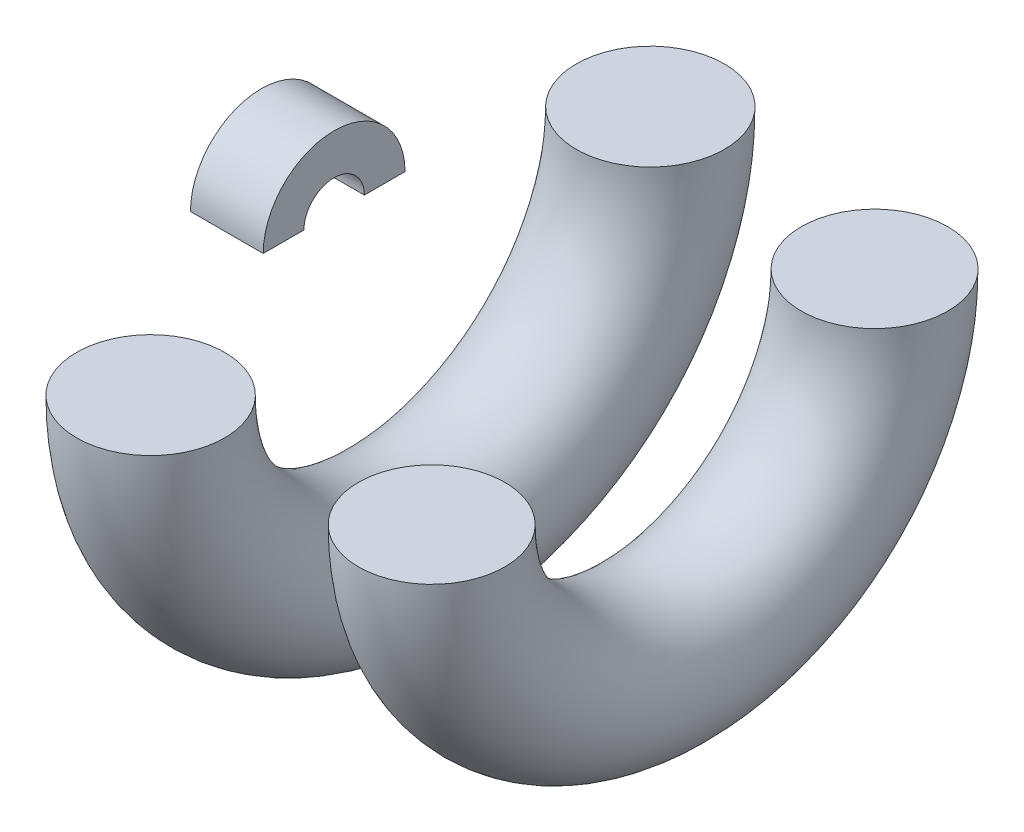
ISO-10303-21;
HEADER;
FILE_DESCRIPTION(('STEP AP214'),'2;1');
FILE_NAME('part.step','',(''),(''),'','','');
FILE_SCHEMA(('AUTOMOTIVE_DESIGN { 1 0 10303 214 1 1 1 1 }'));
ENDSEC;
DATA;
#1=APPLICATION_CONTEXT('core data for automotive mechanical design processes');
#2=APPLICATION_PROTOCOL_DEFINITION('international standard','automotive_design',2000,#1);
#3=PRODUCT_CONTEXT('',#1,'mechanical');
#4=PRODUCT('Part','Part','',(#3));
#5=PRODUCT_RELATED_PRODUCT_CATEGORY('part','',(#4));
#6=PRODUCT_DEFINITION_FORMATION('','',#4);
#7=PRODUCT_DEFINITION_CONTEXT('part definition',#1,'design');
#8=PRODUCT_DEFINITION('design','',#6,#7);
#9=PRODUCT_DEFINITION_SHAPE('','',#8);
#10=(LENGTH_UNIT() NAMED_UNIT(*) SI_UNIT(.MILLI.,.METRE.));
#11=(NAMED_UNIT(*) PLANE_ANGLE_UNIT() SI_UNIT($,.RADIAN.));
#12=(NAMED_UNIT(*) SI_UNIT($,.STERADIAN.) SOLID_ANGLE_UNIT());
#13=UNCERTAINTY_MEASURE_WITH_UNIT(LENGTH_MEASURE(1.E-05),#10,'distance_accuracy_value','');
#14=(GEOMETRIC_REPRESENTATION_CONTEXT(3) GLOBAL_UNCERTAINTY_ASSIGNED_CONTEXT((#13)) GLOBAL_UNIT_ASSIGNED_CONTEXT((#10,
#11,#12)) REPRESENTATION_CONTEXT('',''));
#15=CARTESIAN_POINT('',(0.,0.,0.));
#16=DIRECTION('',(0.,0.,1.));
#17=DIRECTION('',(1.,0.,0.));
#18=AXIS2_PLACEMENT_3D('',#15,#16,#17);
#19=CARTESIAN_POINT('',(262.645080015213,-53.088327744578,0.));
#20=DIRECTION('',(-1.,0.,0.));
#21=DIRECTION('',(0.,0.,1.));
#22=AXIS2_PLACEMENT_3D('',#19,#20,#21);
#23=TOROIDAL_SURFACE('',#22,364.479317737274,108.06233186603);
#24=CARTESIAN_POINT('',(262.645080015213,-53.0883277445767,-364.479317737274));
#25=DIRECTION('',(0.,-1.,0.));
#26=DIRECTION('',(1.,0.,0.));
#27=AXIS2_PLACEMENT_3D('',#24,#25,#26);
#28=CIRCLE('',#27,108.06233186603);
#29=CARTESIAN_POINT('',(262.645080015213,-53.0883277445764,-472.541649603304));
#30=VERTEX_POINT('',#29);
#31=EDGE_CURVE('E11',#30,#30,#28,.T.);
#32=CARTESIAN_POINT('',(262.645080015213,-53.0883277445767,364.479317737274));
#33=DIRECTION('',(0.,1.,0.));
#34=DIRECTION('',(1.,0.,0.));
#35=AXIS2_PLACEMENT_3D('',#32,#33,#34);
#36=CIRCLE('',#35,108.06233186603);
#37=CARTESIAN_POINT('',(262.645080015213,-53.0883277445764,472.541649603304));
#38=VERTEX_POINT('',#37);
#39=EDGE_CURVE('E46',#38,#38,#36,.T.);
#40=CARTESIAN_POINT('',(262.645080015213,-53.088327744578,0.));
#41=DIRECTION('',(-1.,0.,0.));
#42=DIRECTION('',(0.,0.,1.));
#43=AXIS2_PLACEMENT_3D('',#40,#41,#42);
#44=CIRCLE('',#43,472.541649603304);
#45=EDGE_CURVE('',#30,#38,#44,.T.);
#46=ORIENTED_EDGE('',*,*,#31,.T.);
#47=ORIENTED_EDGE('',*,*,#39,.F.);
#48=ORIENTED_EDGE('',*,*,#45,.T.);
#49=ORIENTED_EDGE('',*,*,#45,.F.);
#50=EDGE_LOOP('',(#46,#48,#47,#49));
#51=FACE_BOUND('',#50,.T.);
#52=ADVANCED_FACE('F40',(#51),#23,.T.);
#53=CARTESIAN_POINT('',(262.645080015213,-53.0883277445767,-364.479317737274));
#54=DIRECTION('',(0.,-1.,0.));
#55=DIRECTION('',(1.,0.,0.));
#56=AXIS2_PLACEMENT_3D('',#53,#54,#55);
#57=PLANE('',#56);
#58=ORIENTED_EDGE('',*,*,#31,.F.);
#59=EDGE_LOOP('',(#58));
#60=FACE_BOUND('',#59,.T.);
#61=ADVANCED_FACE('F55',(#60),#57,.F.);
#62=CARTESIAN_POINT('',(262.645080015213,-53.0883277445767,364.479317737274));
#63=DIRECTION('',(0.,1.,0.));
#64=DIRECTION('',(1.,0.,0.));
#65=AXIS2_PLACEMENT_3D('',#62,#63,#64);
#66=PLANE('',#65);
#67=ORIENTED_EDGE('',*,*,#39,.T.);
#68=EDGE_LOOP('',(#67));
#69=FACE_BOUND('',#68,.T.);
#70=ADVANCED_FACE('F52',(#69),#66,.T.);
#71=CLOSED_SHELL('',(#52,#61,#70));
#72=MANIFOLD_SOLID_BREP('B2',#71);
#73=CARTESIAN_POINT('',(631.198679849646,-53.088327744578,0.));
#74=DIRECTION('',(-1.,0.,0.));
#75=DIRECTION('',(0.,0.,1.));
#76=AXIS2_PLACEMENT_3D('',#73,#74,#75);
#77=TOROIDAL_SURFACE('',#76,323.060047152095,106.79906105693);
#78=CARTESIAN_POINT('',(631.198679849646,-53.0883277445769,-323.060047152095));
#79=DIRECTION('',(0.,-1.,0.));
#80=DIRECTION('',(1.,0.,0.));
#81=AXIS2_PLACEMENT_3D('',#78,#79,#80);
#82=CIRCLE('',#81,106.79906105693);
#83=CARTESIAN_POINT('',(631.198679849646,-53.0883277445765,-429.859108209025));
#84=VERTEX_POINT('',#83);
#85=EDGE_CURVE('E39',#84,#84,#82,.T.);
#86=CARTESIAN_POINT('',(631.198679849646,-53.0883277445769,323.060047152095));
#87=DIRECTION('',(0.,1.,0.));
#88=DIRECTION('',(1.,0.,0.));
#89=AXIS2_PLACEMENT_3D('',#86,#87,#88);
#90=CIRCLE('',#89,106.79906105693);
#91=CARTESIAN_POINT('',(631.198679849646,-53.0883277445765,429.859108209025));
#92=VERTEX_POINT('',#91);
#93=EDGE_CURVE('E96',#92,#92,#90,.T.);
#94=CARTESIAN_POINT('',(631.198679849646,-53.088327744578,0.));
#95=DIRECTION('',(-1.,0.,0.));
#96=DIRECTION('',(0.,0.,1.));
#97=AXIS2_PLACEMENT_3D('',#94,#95,#96);
#98=CIRCLE('',#97,429.859108209025);
#99=EDGE_CURVE('',#84,#92,#98,.T.);
#100=ORIENTED_EDGE('',*,*,#85,.T.);
#101=ORIENTED_EDGE('',*,*,#93,.F.);
#102=ORIENTED_EDGE('',*,*,#99,.T.);
#103=ORIENTED_EDGE('',*,*,#99,.F.);
#104=EDGE_LOOP('',(#100,#102,#101,#103));
#105=FACE_BOUND('',#104,.T.);
#106=ADVANCED_FACE('F90',(#105),#77,.T.);
#107=CARTESIAN_POINT('',(631.198679849646,-53.0883277445769,-323.060047152095));
#108=DIRECTION('',(0.,-1.,0.));
#109=DIRECTION('',(1.,0.,0.));
#110=AXIS2_PLACEMENT_3D('',#107,#108,#109);
#111=PLANE('',#110);
#112=ORIENTED_EDGE('',*,*,#85,.F.);
#113=EDGE_LOOP('',(#112));
#114=FACE_BOUND('',#113,.T.);
#115=ADVANCED_FACE('F105',(#114),#111,.F.);
#116=CARTESIAN_POINT('',(631.198679849646,-53.0883277445769,323.060047152095));
#117=DIRECTION('',(0.,1.,0.));
#118=DIRECTION('',(1.,0.,0.));
#119=AXIS2_PLACEMENT_3D('',#116,#117,#118);
#120=PLANE('',#119);
#121=ORIENTED_EDGE('',*,*,#93,.T.);
#122=EDGE_LOOP('',(#121));
#123=FACE_BOUND('',#122,.T.);
#124=ADVANCED_FACE('F102',(#123),#120,.T.);
#125=CLOSED_SHELL('',(#106,#115,#124));
#126=MANIFOLD_SOLID_BREP('B6',#125);
#127=CARTESIAN_POINT('',(59.655955919165,-53.0883277445782,44.0578390045209));
#128=DIRECTION('',(1.,0.,0.));
#129=DIRECTION('',(0.,0.,-1.));
#130=AXIS2_PLACEMENT_3D('',#127,#128,#129);
#131=PLANE('',#130);
#132=CARTESIAN_POINT('',(59.655955919165,-53.088327744578,0.));
#133=DIRECTION('',(-1.,0.,0.));
#134=DIRECTION('',(0.,0.,1.));
#135=AXIS2_PLACEMENT_3D('',#132,#133,#134);
#136=CIRCLE('',#135,103.440143749745);
#137=CARTESIAN_POINT('',(59.655955919165,-53.0883277445784,103.440143749745));
#138=VERTEX_POINT('',#137);
#139=CARTESIAN_POINT('',(59.655955919165,-53.0883277445784,-103.440143749745));
#140=VERTEX_POINT('',#139);
#141=EDGE_CURVE('E88',#138,#140,#136,.T.);
#142=ORIENTED_EDGE('',*,*,#141,.T.);
#143=DIRECTION('',(0.,0.,1.));
#144=VECTOR('',#143,1.);
#145=CARTESIAN_POINT('',(59.655955919165,-53.0883277445782,-44.0578390045209));
#146=LINE('',#145,#144);
#147=CARTESIAN_POINT('',(59.655955919165,-53.0883277445782,-44.0578390045209));
#148=VERTEX_POINT('',#147);
#149=EDGE_CURVE('E189',#140,#148,#146,.T.);
#150=ORIENTED_EDGE('',*,*,#149,.T.);
#151=CARTESIAN_POINT('',(59.655955919165,-53.088327744578,0.));
#152=DIRECTION('',(-1.,0.,0.));
#153=DIRECTION('',(0.,0.,1.));
#154=AXIS2_PLACEMENT_3D('',#151,#152,#153);
#155=CIRCLE('',#154,44.0578390045209);
#156=CARTESIAN_POINT('',(59.655955919165,-53.0883277445782,44.0578390045209));
#157=VERTEX_POINT('',#156);
#158=EDGE_CURVE('E171',#157,#148,#155,.T.);
#159=ORIENTED_EDGE('',*,*,#158,.F.);
#160=DIRECTION('',(0.,0.,-1.));
#161=VECTOR('',#160,1.);
#162=CARTESIAN_POINT('',(59.655955919165,-53.0883277445782,44.0578390045209));
#163=LINE('',#162,#161);
#164=EDGE_CURVE('E197',#138,#157,#163,.T.);
#165=ORIENTED_EDGE('',*,*,#164,.F.);
#166=EDGE_LOOP('',(#142,#150,#159,#165));
#167=FACE_BOUND('',#166,.T.);
#168=ADVANCED_FACE('F131',(#167),#131,.F.);
#169=CARTESIAN_POINT('',(0.,-53.088327744578,0.));
#170=DIRECTION('',(-1.,0.,0.));
#171=DIRECTION('',(0.,0.,1.));
#172=AXIS2_PLACEMENT_3D('',#169,#170,#171);
#173=CYLINDRICAL_SURFACE('',#172,103.440143749745);
#174=CARTESIAN_POINT('',(165.832611408321,-53.088327744578,0.));
#175=DIRECTION('',(-1.,0.,0.));
#176=DIRECTION('',(0.,0.,1.));
#177=AXIS2_PLACEMENT_3D('',#174,#175,#176);
#178=CIRCLE('',#177,103.440143749745);
#179=CARTESIAN_POINT('',(165.832611408321,-53.0883277445784,103.440143749745));
#180=VERTEX_POINT('',#179);
#181=CARTESIAN_POINT('',(165.832611408321,-53.0883277445784,-103.440143749745));
#182=VERTEX_POINT('',#181);
#183=EDGE_CURVE('E139',#180,#182,#178,.T.);
#184=ORIENTED_EDGE('',*,*,#183,.T.);
#185=DIRECTION('',(-1.,0.,0.));
#186=VECTOR('',#185,1.);
#187=CARTESIAN_POINT('',(59.655955919165,-53.0883277445784,-103.440143749745));
#188=LINE('',#187,#186);
#189=EDGE_CURVE('E195',#182,#140,#188,.T.);
#190=ORIENTED_EDGE('',*,*,#189,.T.);
#191=ORIENTED_EDGE('',*,*,#141,.F.);
#192=DIRECTION('',(-1.,0.,0.));
#193=VECTOR('',#192,1.);
#194=CARTESIAN_POINT('',(59.655955919165,-53.0883277445784,103.440143749745));
#195=LINE('',#194,#193);
#196=EDGE_CURVE('E183',#180,#138,#195,.T.);
#197=ORIENTED_EDGE('',*,*,#196,.F.);
#198=EDGE_LOOP('',(#184,#190,#191,#197));
#199=FACE_BOUND('',#198,.T.);
#200=ADVANCED_FACE('F133',(#199),#173,.T.);
#201=CARTESIAN_POINT('',(165.832611408321,-53.0883277445782,44.0578390045209));
#202=DIRECTION('',(-1.,0.,0.));
#203=DIRECTION('',(0.,0.,1.));
#204=AXIS2_PLACEMENT_3D('',#201,#202,#203);
#205=PLANE('',#204);
#206=CARTESIAN_POINT('',(165.832611408321,-53.088327744578,0.));
#207=DIRECTION('',(-1.,0.,0.));
#208=DIRECTION('',(0.,0.,1.));
#209=AXIS2_PLACEMENT_3D('',#206,#207,#208);
#210=CIRCLE('',#209,44.0578390045209);
#211=CARTESIAN_POINT('',(165.832611408321,-53.0883277445782,44.0578390045209));
#212=VERTEX_POINT('',#211);
#213=CARTESIAN_POINT('',(165.832611408321,-53.0883277445782,-44.0578390045209));
#214=VERTEX_POINT('',#213);
#215=EDGE_CURVE('E182',#212,#214,#210,.T.);
#216=ORIENTED_EDGE('',*,*,#215,.T.);
#217=DIRECTION('',(0.,0.,-1.));
#218=VECTOR('',#217,1.);
#219=CARTESIAN_POINT('',(165.832611408321,-53.0883277445782,-44.0578390045209));
#220=LINE('',#219,#218);
#221=EDGE_CURVE('E190',#214,#182,#220,.T.);
#222=ORIENTED_EDGE('',*,*,#221,.T.);
#223=ORIENTED_EDGE('',*,*,#183,.F.);
#224=DIRECTION('',(0.,0.,1.));
#225=VECTOR('',#224,1.);
#226=CARTESIAN_POINT('',(165.832611408321,-53.0883277445782,44.0578390045209));
#227=LINE('',#226,#225);
#228=EDGE_CURVE('E200',#212,#180,#227,.T.);
#229=ORIENTED_EDGE('',*,*,#228,.F.);
#230=EDGE_LOOP('',(#216,#222,#223,#229));
#231=FACE_BOUND('',#230,.T.);
#232=ADVANCED_FACE('F203',(#231),#205,.F.);
#233=CARTESIAN_POINT('',(0.,-53.088327744578,0.));
#234=DIRECTION('',(-1.,0.,0.));
#235=DIRECTION('',(0.,0.,1.));
#236=AXIS2_PLACEMENT_3D('',#233,#234,#235);
#237=CYLINDRICAL_SURFACE('',#236,44.0578390045209);
#238=DIRECTION('',(1.,0.,0.));
#239=VECTOR('',#238,1.);
#240=CARTESIAN_POINT('',(59.655955919165,-53.0883277445782,44.0578390045209));
#241=LINE('',#240,#239);
#242=EDGE_CURVE('E177',#157,#212,#241,.T.);
#243=ORIENTED_EDGE('',*,*,#242,.F.);
#244=ORIENTED_EDGE('',*,*,#158,.T.);
#245=DIRECTION('',(1.,0.,0.));
#246=VECTOR('',#245,1.);
#247=CARTESIAN_POINT('',(59.655955919165,-53.0883277445782,-44.0578390045209));
#248=LINE('',#247,#246);
#249=EDGE_CURVE('E174',#148,#214,#248,.T.);
#250=ORIENTED_EDGE('',*,*,#249,.T.);
#251=ORIENTED_EDGE('',*,*,#215,.F.);
#252=EDGE_LOOP('',(#243,#244,#250,#251));
#253=FACE_BOUND('',#252,.T.);
#254=ADVANCED_FACE('F173',(#253),#237,.F.);
#255=CARTESIAN_POINT('',(0.,-53.0883277445782,53.088327744578));
#256=DIRECTION('',(0.,1.,0.));
#257=DIRECTION('',(-1.,0.,0.));
#258=AXIS2_PLACEMENT_3D('',#255,#256,#257);
#259=PLANE('',#258);
#260=ORIENTED_EDGE('',*,*,#164,.T.);
#261=ORIENTED_EDGE('',*,*,#242,.T.);
#262=ORIENTED_EDGE('',*,*,#228,.T.);
#263=ORIENTED_EDGE('',*,*,#196,.T.);
#264=EDGE_LOOP('',(#260,#261,#262,#263));
#265=FACE_BOUND('',#264,.T.);
#266=ADVANCED_FACE('F205',(#265),#259,.F.);
#267=CARTESIAN_POINT('',(0.,-53.0883277445782,-53.088327744578));
#268=DIRECTION('',(0.,-1.,0.));
#269=DIRECTION('',(-1.,0.,0.));
#270=AXIS2_PLACEMENT_3D('',#267,#268,#269);
#271=PLANE('',#270);
#272=ORIENTED_EDGE('',*,*,#149,.F.);
#273=ORIENTED_EDGE('',*,*,#189,.F.);
#274=ORIENTED_EDGE('',*,*,#221,.F.);
#275=ORIENTED_EDGE('',*,*,#249,.F.);
#276=EDGE_LOOP('',(#272,#273,#274,#275));
#277=FACE_BOUND('',#276,.T.);
#278=ADVANCED_FACE('F187',(#277),#271,.T.);
#279=CLOSED_SHELL('',(#168,#200,#232,#254,#266,#278));
#280=MANIFOLD_SOLID_BREP('B34',#279);
#281=ADVANCED_BREP_SHAPE_REPRESENTATION('',(#18,#72,#126,#280),#14);
#282=SHAPE_DEFINITION_REPRESENTATION(#9,#281);
ENDSEC;
END-ISO-10303-21;
